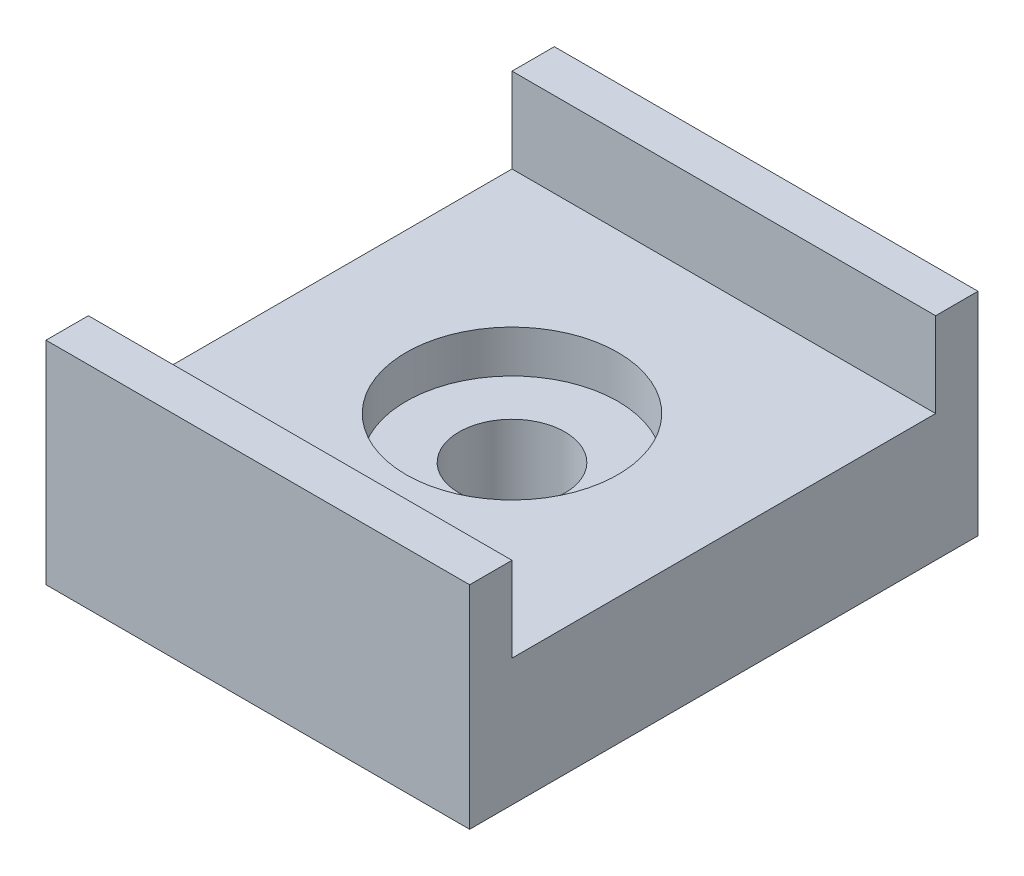
ISO-10303-21;
HEADER;
FILE_DESCRIPTION(('STEP AP214'),'2;1');
FILE_NAME('part.step','',(''),(''),'','','');
FILE_SCHEMA(('AUTOMOTIVE_DESIGN { 1 0 10303 214 1 1 1 1 }'));
ENDSEC;
DATA;
#1=APPLICATION_CONTEXT('core data for automotive mechanical design processes');
#2=APPLICATION_PROTOCOL_DEFINITION('international standard','automotive_design',2000,#1);
#3=PRODUCT_CONTEXT('',#1,'mechanical');
#4=PRODUCT('Part','Part','',(#3));
#5=PRODUCT_RELATED_PRODUCT_CATEGORY('part','',(#4));
#6=PRODUCT_DEFINITION_FORMATION('','',#4);
#7=PRODUCT_DEFINITION_CONTEXT('part definition',#1,'design');
#8=PRODUCT_DEFINITION('design','',#6,#7);
#9=PRODUCT_DEFINITION_SHAPE('','',#8);
#10=(LENGTH_UNIT() NAMED_UNIT(*) SI_UNIT(.MILLI.,.METRE.));
#11=(NAMED_UNIT(*) PLANE_ANGLE_UNIT() SI_UNIT($,.RADIAN.));
#12=(NAMED_UNIT(*) SI_UNIT($,.STERADIAN.) SOLID_ANGLE_UNIT());
#13=UNCERTAINTY_MEASURE_WITH_UNIT(LENGTH_MEASURE(1.E-05),#10,'distance_accuracy_value','');
#14=(GEOMETRIC_REPRESENTATION_CONTEXT(3) GLOBAL_UNCERTAINTY_ASSIGNED_CONTEXT((#13)) GLOBAL_UNIT_ASSIGNED_CONTEXT((#10,
#11,#12)) REPRESENTATION_CONTEXT('',''));
#15=CARTESIAN_POINT('',(0.,0.,0.));
#16=DIRECTION('',(0.,0.,1.));
#17=DIRECTION('',(1.,0.,0.));
#18=AXIS2_PLACEMENT_3D('',#15,#16,#17);
#19=CARTESIAN_POINT('',(12.7,0.,-15.24));
#20=DIRECTION('',(0.,1.,0.));
#21=DIRECTION('',(0.,0.,1.));
#22=AXIS2_PLACEMENT_3D('',#19,#20,#21);
#23=CYLINDRICAL_SURFACE('',#22,3.175);
#24=CARTESIAN_POINT('',(12.7,0.,-15.24));
#25=DIRECTION('',(0.,1.,0.));
#26=DIRECTION('',(0.,0.,1.));
#27=AXIS2_PLACEMENT_3D('',#24,#25,#26);
#28=CIRCLE('',#27,3.175);
#29=CARTESIAN_POINT('',(12.7,0.,-12.065));
#30=VERTEX_POINT('',#29);
#31=EDGE_CURVE('E141',#30,#30,#28,.T.);
#32=CARTESIAN_POINT('',(12.7,5.08,-15.24));
#33=DIRECTION('',(0.,1.,0.));
#34=DIRECTION('',(0.,0.,1.));
#35=AXIS2_PLACEMENT_3D('',#32,#33,#34);
#36=CIRCLE('',#35,3.175);
#37=CARTESIAN_POINT('',(12.7,5.08,-12.065));
#38=VERTEX_POINT('',#37);
#39=EDGE_CURVE('E43',#38,#38,#36,.F.);
#40=CARTESIAN_POINT('',(12.7,0.,-12.065));
#41=CARTESIAN_POINT('',(12.7,0.0529166666666667,-12.065));
#42=CARTESIAN_POINT('',(12.7,0.105833333333333,-12.065));
#43=CARTESIAN_POINT('',(12.7,0.211666666666667,-12.065));
#44=CARTESIAN_POINT('',(12.7,0.264583333333333,-12.065));
#45=CARTESIAN_POINT('',(12.7,0.370416666666667,-12.065));
#46=CARTESIAN_POINT('',(12.7,0.423333333333333,-12.065));
#47=CARTESIAN_POINT('',(12.7,0.529166666666666,-12.065));
#48=CARTESIAN_POINT('',(12.7,0.582083333333333,-12.065));
#49=CARTESIAN_POINT('',(12.7,0.687916666666667,-12.065));
#50=CARTESIAN_POINT('',(12.7,0.740833333333333,-12.065));
#51=CARTESIAN_POINT('',(12.7,0.846666666666666,-12.065));
#52=CARTESIAN_POINT('',(12.7,0.899583333333333,-12.065));
#53=CARTESIAN_POINT('',(12.7,1.00541666666667,-12.065));
#54=CARTESIAN_POINT('',(12.7,1.05833333333333,-12.065));
#55=CARTESIAN_POINT('',(12.7,1.16416666666667,-12.065));
#56=CARTESIAN_POINT('',(12.7,1.21708333333333,-12.065));
#57=CARTESIAN_POINT('',(12.7,1.32291666666667,-12.065));
#58=CARTESIAN_POINT('',(12.7,1.37583333333333,-12.065));
#59=CARTESIAN_POINT('',(12.7,1.48166666666667,-12.065));
#60=CARTESIAN_POINT('',(12.7,1.53458333333333,-12.065));
#61=CARTESIAN_POINT('',(12.7,1.64041666666667,-12.065));
#62=CARTESIAN_POINT('',(12.7,1.69333333333333,-12.065));
#63=CARTESIAN_POINT('',(12.7,1.79916666666667,-12.065));
#64=CARTESIAN_POINT('',(12.7,1.85208333333333,-12.065));
#65=CARTESIAN_POINT('',(12.7,1.95791666666667,-12.065));
#66=CARTESIAN_POINT('',(12.7,2.01083333333333,-12.065));
#67=CARTESIAN_POINT('',(12.7,2.11666666666667,-12.065));
#68=CARTESIAN_POINT('',(12.7,2.16958333333333,-12.065));
#69=CARTESIAN_POINT('',(12.7,2.27541666666667,-12.065));
#70=CARTESIAN_POINT('',(12.7,2.32833333333333,-12.065));
#71=CARTESIAN_POINT('',(12.7,2.43416666666667,-12.065));
#72=CARTESIAN_POINT('',(12.7,2.48708333333333,-12.065));
#73=CARTESIAN_POINT('',(12.7,2.59291666666667,-12.065));
#74=CARTESIAN_POINT('',(12.7,2.64583333333333,-12.065));
#75=CARTESIAN_POINT('',(12.7,2.75166666666667,-12.065));
#76=CARTESIAN_POINT('',(12.7,2.80458333333333,-12.065));
#77=CARTESIAN_POINT('',(12.7,2.91041666666667,-12.065));
#78=CARTESIAN_POINT('',(12.7,2.96333333333333,-12.065));
#79=CARTESIAN_POINT('',(12.7,3.06916666666667,-12.065));
#80=CARTESIAN_POINT('',(12.7,3.12208333333333,-12.065));
#81=CARTESIAN_POINT('',(12.7,3.22791666666667,-12.065));
#82=CARTESIAN_POINT('',(12.7,3.28083333333333,-12.065));
#83=CARTESIAN_POINT('',(12.7,3.38666666666667,-12.065));
#84=CARTESIAN_POINT('',(12.7,3.43958333333333,-12.065));
#85=CARTESIAN_POINT('',(12.7,3.54541666666667,-12.065));
#86=CARTESIAN_POINT('',(12.7,3.59833333333333,-12.065));
#87=CARTESIAN_POINT('',(12.7,3.70416666666667,-12.065));
#88=CARTESIAN_POINT('',(12.7,3.75708333333333,-12.065));
#89=CARTESIAN_POINT('',(12.7,3.86291666666667,-12.065));
#90=CARTESIAN_POINT('',(12.7,3.91583333333333,-12.065));
#91=CARTESIAN_POINT('',(12.7,4.02166666666666,-12.065));
#92=CARTESIAN_POINT('',(12.7,4.07458333333333,-12.065));
#93=CARTESIAN_POINT('',(12.7,4.18041666666667,-12.065));
#94=CARTESIAN_POINT('',(12.7,4.23333333333333,-12.065));
#95=CARTESIAN_POINT('',(12.7,4.33916666666666,-12.065));
#96=CARTESIAN_POINT('',(12.7,4.39208333333333,-12.065));
#97=CARTESIAN_POINT('',(12.7,4.49791666666667,-12.065));
#98=CARTESIAN_POINT('',(12.7,4.55083333333333,-12.065));
#99=CARTESIAN_POINT('',(12.7,4.65666666666666,-12.065));
#100=CARTESIAN_POINT('',(12.7,4.70958333333333,-12.065));
#101=CARTESIAN_POINT('',(12.7,4.81541666666666,-12.065));
#102=CARTESIAN_POINT('',(12.7,4.86833333333333,-12.065));
#103=CARTESIAN_POINT('',(12.7,4.97416666666667,-12.065));
#104=CARTESIAN_POINT('',(12.7,5.02708333333333,-12.065));
#105=CARTESIAN_POINT('',(12.7,5.08,-12.065));
#106=B_SPLINE_CURVE_WITH_KNOTS('',3,(#40,#41,#42,#43,#44,#45,#46,#47,#48,#49,#50,#51,#52,#53,
#54,#55,#56,#57,#58,#59,#60,#61,#62,#63,#64,#65,#66,#67,#68,#69,#70,#71,#72,#73,#74,#75,#76,#77,
#78,#79,#80,#81,#82,#83,#84,#85,#86,#87,#88,#89,#90,#91,#92,#93,#94,#95,#96,#97,#98,#99,#100,
#101,#102,#103,#104,#105),.UNSPECIFIED.,.F.,.F.,(4,2,2,2,2,2,2,2,2,2,2,2,2,2,2,2,2,2,2,2,2,2,2,
2,2,2,2,2,2,2,2,2,4),(0.,0.15875,0.3175,0.47625,0.635,0.79375,0.9525,1.11125,1.27,1.42875,
1.5875,1.74625,1.905,2.06375,2.2225,2.38125,2.54,2.69875,2.8575,3.01625,3.175,3.33375,3.4925,
3.65125,3.81,3.96875,4.1275,4.28625,4.445,4.60375,4.7625,4.92125,5.08),.UNSPECIFIED.);
#107=EDGE_CURVE('BSEAM39',#30,#38,#106,.T.);
#108=ORIENTED_EDGE('',*,*,#31,.F.);
#109=ORIENTED_EDGE('',*,*,#39,.F.);
#110=ORIENTED_EDGE('',*,*,#107,.T.);
#111=ORIENTED_EDGE('',*,*,#107,.F.);
#112=EDGE_LOOP('',(#108,#110,#109,#111));
#113=FACE_BOUND('',#112,.T.);
#114=ADVANCED_FACE('F39',(#113),#23,.F.);
#115=CARTESIAN_POINT('',(25.4,0.,0.));
#116=DIRECTION('',(0.,0.,-1.));
#117=DIRECTION('',(-1.,0.,0.));
#118=AXIS2_PLACEMENT_3D('',#115,#116,#117);
#119=PLANE('',#118);
#120=DIRECTION('',(0.,-1.,0.));
#121=VECTOR('',#120,1.);
#122=CARTESIAN_POINT('',(0.,0.,0.));
#123=LINE('',#122,#121);
#124=CARTESIAN_POINT('',(0.,12.7,0.));
#125=VERTEX_POINT('',#124);
#126=CARTESIAN_POINT('',(0.,0.,0.));
#127=VERTEX_POINT('',#126);
#128=EDGE_CURVE('E137',#125,#127,#123,.T.);
#129=ORIENTED_EDGE('',*,*,#128,.T.);
#130=DIRECTION('',(-1.,0.,0.));
#131=VECTOR('',#130,1.);
#132=CARTESIAN_POINT('',(25.4,0.,0.));
#133=LINE('',#132,#131);
#134=CARTESIAN_POINT('',(25.4,0.,0.));
#135=VERTEX_POINT('',#134);
#136=EDGE_CURVE('E11',#135,#127,#133,.T.);
#137=ORIENTED_EDGE('',*,*,#136,.F.);
#138=DIRECTION('',(0.,-1.,0.));
#139=VECTOR('',#138,1.);
#140=CARTESIAN_POINT('',(25.4,0.,0.));
#141=LINE('',#140,#139);
#142=CARTESIAN_POINT('',(25.4,12.7,0.));
#143=VERTEX_POINT('',#142);
#144=EDGE_CURVE('E152',#143,#135,#141,.T.);
#145=ORIENTED_EDGE('',*,*,#144,.F.);
#146=DIRECTION('',(-1.,0.,0.));
#147=VECTOR('',#146,1.);
#148=CARTESIAN_POINT('',(25.4,12.7,0.));
#149=LINE('',#148,#147);
#150=EDGE_CURVE('E133',#143,#125,#149,.T.);
#151=ORIENTED_EDGE('',*,*,#150,.T.);
#152=EDGE_LOOP('',(#129,#137,#145,#151));
#153=FACE_BOUND('',#152,.T.);
#154=ADVANCED_FACE('F41',(#153),#119,.F.);
#155=CARTESIAN_POINT('',(25.4,0.,0.));
#156=DIRECTION('',(0.,1.,0.));
#157=DIRECTION('',(0.,0.,1.));
#158=AXIS2_PLACEMENT_3D('',#155,#156,#157);
#159=PLANE('',#158);
#160=ORIENTED_EDGE('',*,*,#31,.T.);
#161=EDGE_LOOP('',(#160));
#162=FACE_BOUND('',#161,.T.);
#163=DIRECTION('',(0.,0.,-1.));
#164=VECTOR('',#163,1.);
#165=CARTESIAN_POINT('',(0.,0.,0.));
#166=LINE('',#165,#164);
#167=CARTESIAN_POINT('',(0.,0.,-30.48));
#168=VERTEX_POINT('',#167);
#169=EDGE_CURVE('E140',#127,#168,#166,.T.);
#170=ORIENTED_EDGE('',*,*,#169,.T.);
#171=DIRECTION('',(-1.,0.,0.));
#172=VECTOR('',#171,1.);
#173=CARTESIAN_POINT('',(25.4,0.,-30.48));
#174=LINE('',#173,#172);
#175=CARTESIAN_POINT('',(25.4,0.,-30.48));
#176=VERTEX_POINT('',#175);
#177=EDGE_CURVE('E49',#176,#168,#174,.T.);
#178=ORIENTED_EDGE('',*,*,#177,.F.);
#179=DIRECTION('',(0.,0.,-1.));
#180=VECTOR('',#179,1.);
#181=CARTESIAN_POINT('',(25.4,0.,0.));
#182=LINE('',#181,#180);
#183=EDGE_CURVE('E100',#135,#176,#182,.T.);
#184=ORIENTED_EDGE('',*,*,#183,.F.);
#185=ORIENTED_EDGE('',*,*,#136,.T.);
#186=EDGE_LOOP('',(#170,#178,#184,#185));
#187=FACE_BOUND('',#186,.T.);
#188=ADVANCED_FACE('F208',(#162,#187),#159,.F.);
#189=CARTESIAN_POINT('',(25.4,0.,-30.48));
#190=DIRECTION('',(0.,0.,1.));
#191=DIRECTION('',(1.,0.,0.));
#192=AXIS2_PLACEMENT_3D('',#189,#190,#191);
#193=PLANE('',#192);
#194=DIRECTION('',(0.,1.,0.));
#195=VECTOR('',#194,1.);
#196=CARTESIAN_POINT('',(0.,0.,-30.48));
#197=LINE('',#196,#195);
#198=CARTESIAN_POINT('',(0.,12.7,-30.48));
#199=VERTEX_POINT('',#198);
#200=EDGE_CURVE('E143',#168,#199,#197,.T.);
#201=ORIENTED_EDGE('',*,*,#200,.T.);
#202=DIRECTION('',(-1.,0.,0.));
#203=VECTOR('',#202,1.);
#204=CARTESIAN_POINT('',(25.4,12.7,-30.48));
#205=LINE('',#204,#203);
#206=CARTESIAN_POINT('',(25.4,12.7,-30.48));
#207=VERTEX_POINT('',#206);
#208=EDGE_CURVE('E159',#207,#199,#205,.T.);
#209=ORIENTED_EDGE('',*,*,#208,.F.);
#210=DIRECTION('',(0.,1.,0.));
#211=VECTOR('',#210,1.);
#212=CARTESIAN_POINT('',(25.4,0.,-30.48));
#213=LINE('',#212,#211);
#214=EDGE_CURVE('E168',#176,#207,#213,.T.);
#215=ORIENTED_EDGE('',*,*,#214,.F.);
#216=ORIENTED_EDGE('',*,*,#177,.T.);
#217=EDGE_LOOP('',(#201,#209,#215,#216));
#218=FACE_BOUND('',#217,.T.);
#219=ADVANCED_FACE('F166',(#218),#193,.F.);
#220=CARTESIAN_POINT('',(25.4,12.7,-27.94));
#221=DIRECTION('',(0.,-1.,0.));
#222=DIRECTION('',(0.,0.,-1.));
#223=AXIS2_PLACEMENT_3D('',#220,#221,#222);
#224=PLANE('',#223);
#225=DIRECTION('',(0.,0.,1.));
#226=VECTOR('',#225,1.);
#227=CARTESIAN_POINT('',(0.,12.7,-27.94));
#228=LINE('',#227,#226);
#229=CARTESIAN_POINT('',(0.,12.7,-27.94));
#230=VERTEX_POINT('',#229);
#231=EDGE_CURVE('E145',#199,#230,#228,.T.);
#232=ORIENTED_EDGE('',*,*,#231,.T.);
#233=DIRECTION('',(-1.,0.,0.));
#234=VECTOR('',#233,1.);
#235=CARTESIAN_POINT('',(25.4,12.7,-27.94));
#236=LINE('',#235,#234);
#237=CARTESIAN_POINT('',(25.4,12.7,-27.94));
#238=VERTEX_POINT('',#237);
#239=EDGE_CURVE('E156',#238,#230,#236,.T.);
#240=ORIENTED_EDGE('',*,*,#239,.F.);
#241=DIRECTION('',(0.,0.,1.));
#242=VECTOR('',#241,1.);
#243=CARTESIAN_POINT('',(25.4,12.7,-27.94));
#244=LINE('',#243,#242);
#245=EDGE_CURVE('E180',#207,#238,#244,.T.);
#246=ORIENTED_EDGE('',*,*,#245,.F.);
#247=ORIENTED_EDGE('',*,*,#208,.T.);
#248=EDGE_LOOP('',(#232,#240,#246,#247));
#249=FACE_BOUND('',#248,.T.);
#250=ADVANCED_FACE('F176',(#249),#224,.F.);
#251=CARTESIAN_POINT('',(25.4,12.7,-27.94));
#252=DIRECTION('',(0.,0.,-1.));
#253=DIRECTION('',(-1.,0.,0.));
#254=AXIS2_PLACEMENT_3D('',#251,#252,#253);
#255=PLANE('',#254);
#256=DIRECTION('',(0.,-1.,0.));
#257=VECTOR('',#256,1.);
#258=CARTESIAN_POINT('',(0.,12.7,-27.94));
#259=LINE('',#258,#257);
#260=CARTESIAN_POINT('',(0.,7.62,-27.94));
#261=VERTEX_POINT('',#260);
#262=EDGE_CURVE('E147',#230,#261,#259,.T.);
#263=ORIENTED_EDGE('',*,*,#262,.T.);
#264=DIRECTION('',(-1.,0.,0.));
#265=VECTOR('',#264,1.);
#266=CARTESIAN_POINT('',(25.4,7.62,-27.94));
#267=LINE('',#266,#265);
#268=CARTESIAN_POINT('',(25.4,7.62,-27.94));
#269=VERTEX_POINT('',#268);
#270=EDGE_CURVE('E128',#269,#261,#267,.T.);
#271=ORIENTED_EDGE('',*,*,#270,.F.);
#272=DIRECTION('',(0.,-1.,0.));
#273=VECTOR('',#272,1.);
#274=CARTESIAN_POINT('',(25.4,12.7,-27.94));
#275=LINE('',#274,#273);
#276=EDGE_CURVE('E119',#238,#269,#275,.T.);
#277=ORIENTED_EDGE('',*,*,#276,.F.);
#278=ORIENTED_EDGE('',*,*,#239,.T.);
#279=EDGE_LOOP('',(#263,#271,#277,#278));
#280=FACE_BOUND('',#279,.T.);
#281=ADVANCED_FACE('F179',(#280),#255,.F.);
#282=CARTESIAN_POINT('',(25.4,7.62,-2.53999999999999));
#283=DIRECTION('',(0.,-1.,0.));
#284=DIRECTION('',(0.,0.,-1.));
#285=AXIS2_PLACEMENT_3D('',#282,#283,#284);
#286=PLANE('',#285);
#287=CARTESIAN_POINT('',(12.7,7.62,-15.24));
#288=DIRECTION('',(0.,1.,0.));
#289=DIRECTION('',(0.,0.,1.));
#290=AXIS2_PLACEMENT_3D('',#287,#288,#289);
#291=CIRCLE('',#290,6.35);
#292=CARTESIAN_POINT('',(12.7,7.62,-8.89));
#293=VERTEX_POINT('',#292);
#294=EDGE_CURVE('E188',#293,#293,#291,.T.);
#295=ORIENTED_EDGE('',*,*,#294,.F.);
#296=EDGE_LOOP('',(#295));
#297=FACE_BOUND('',#296,.T.);
#298=DIRECTION('',(0.,0.,1.));
#299=VECTOR('',#298,1.);
#300=CARTESIAN_POINT('',(0.,7.62,-2.53999999999999));
#301=LINE('',#300,#299);
#302=CARTESIAN_POINT('',(0.,7.62,-2.53999999999999));
#303=VERTEX_POINT('',#302);
#304=EDGE_CURVE('E127',#261,#303,#301,.T.);
#305=ORIENTED_EDGE('',*,*,#304,.T.);
#306=DIRECTION('',(-1.,0.,0.));
#307=VECTOR('',#306,1.);
#308=CARTESIAN_POINT('',(25.4,7.62,-2.53999999999999));
#309=LINE('',#308,#307);
#310=CARTESIAN_POINT('',(25.4,7.62,-2.53999999999999));
#311=VERTEX_POINT('',#310);
#312=EDGE_CURVE('E124',#311,#303,#309,.T.);
#313=ORIENTED_EDGE('',*,*,#312,.F.);
#314=DIRECTION('',(0.,0.,1.));
#315=VECTOR('',#314,1.);
#316=CARTESIAN_POINT('',(25.4,7.62,-2.53999999999999));
#317=LINE('',#316,#315);
#318=EDGE_CURVE('E113',#269,#311,#317,.T.);
#319=ORIENTED_EDGE('',*,*,#318,.F.);
#320=ORIENTED_EDGE('',*,*,#270,.T.);
#321=EDGE_LOOP('',(#305,#313,#319,#320));
#322=FACE_BOUND('',#321,.T.);
#323=ADVANCED_FACE('F125',(#297,#322),#286,.F.);
#324=CARTESIAN_POINT('',(25.4,12.7,-2.54));
#325=DIRECTION('',(0.,0.,1.));
#326=DIRECTION('',(0.,-1.,0.));
#327=AXIS2_PLACEMENT_3D('',#324,#325,#326);
#328=PLANE('',#327);
#329=DIRECTION('',(0.,1.,0.));
#330=VECTOR('',#329,1.);
#331=CARTESIAN_POINT('',(0.,12.7,-2.54));
#332=LINE('',#331,#330);
#333=CARTESIAN_POINT('',(0.,12.7,-2.54));
#334=VERTEX_POINT('',#333);
#335=EDGE_CURVE('E86',#303,#334,#332,.T.);
#336=ORIENTED_EDGE('',*,*,#335,.T.);
#337=DIRECTION('',(-1.,0.,0.));
#338=VECTOR('',#337,1.);
#339=CARTESIAN_POINT('',(25.4,12.7,-2.54));
#340=LINE('',#339,#338);
#341=CARTESIAN_POINT('',(25.4,12.7,-2.54));
#342=VERTEX_POINT('',#341);
#343=EDGE_CURVE('E129',#342,#334,#340,.T.);
#344=ORIENTED_EDGE('',*,*,#343,.F.);
#345=DIRECTION('',(0.,1.,0.));
#346=VECTOR('',#345,1.);
#347=CARTESIAN_POINT('',(25.4,12.7,-2.54));
#348=LINE('',#347,#346);
#349=EDGE_CURVE('E117',#311,#342,#348,.T.);
#350=ORIENTED_EDGE('',*,*,#349,.F.);
#351=ORIENTED_EDGE('',*,*,#312,.T.);
#352=EDGE_LOOP('',(#336,#344,#350,#351));
#353=FACE_BOUND('',#352,.T.);
#354=ADVANCED_FACE('F131',(#353),#328,.F.);
#355=CARTESIAN_POINT('',(25.4,12.7,0.));
#356=DIRECTION('',(0.,-1.,0.));
#357=DIRECTION('',(0.,0.,-1.));
#358=AXIS2_PLACEMENT_3D('',#355,#356,#357);
#359=PLANE('',#358);
#360=DIRECTION('',(0.,0.,1.));
#361=VECTOR('',#360,1.);
#362=CARTESIAN_POINT('',(0.,12.7,0.));
#363=LINE('',#362,#361);
#364=EDGE_CURVE('E92',#334,#125,#363,.T.);
#365=ORIENTED_EDGE('',*,*,#364,.T.);
#366=ORIENTED_EDGE('',*,*,#150,.F.);
#367=DIRECTION('',(0.,0.,1.));
#368=VECTOR('',#367,1.);
#369=CARTESIAN_POINT('',(25.4,12.7,0.));
#370=LINE('',#369,#368);
#371=EDGE_CURVE('E57',#342,#143,#370,.T.);
#372=ORIENTED_EDGE('',*,*,#371,.F.);
#373=ORIENTED_EDGE('',*,*,#343,.T.);
#374=EDGE_LOOP('',(#365,#366,#372,#373));
#375=FACE_BOUND('',#374,.T.);
#376=ADVANCED_FACE('F217',(#375),#359,.F.);
#377=CARTESIAN_POINT('',(25.4,0.,0.));
#378=DIRECTION('',(-1.,0.,0.));
#379=DIRECTION('',(0.,0.,1.));
#380=AXIS2_PLACEMENT_3D('',#377,#378,#379);
#381=PLANE('',#380);
#382=ORIENTED_EDGE('',*,*,#144,.T.);
#383=ORIENTED_EDGE('',*,*,#183,.T.);
#384=ORIENTED_EDGE('',*,*,#214,.T.);
#385=ORIENTED_EDGE('',*,*,#245,.T.);
#386=ORIENTED_EDGE('',*,*,#276,.T.);
#387=ORIENTED_EDGE('',*,*,#318,.T.);
#388=ORIENTED_EDGE('',*,*,#349,.T.);
#389=ORIENTED_EDGE('',*,*,#371,.T.);
#390=EDGE_LOOP('',(#382,#383,#384,#385,#386,#387,#388,#389));
#391=FACE_BOUND('',#390,.T.);
#392=ADVANCED_FACE('F115',(#391),#381,.F.);
#393=CARTESIAN_POINT('',(0.,0.,0.));
#394=DIRECTION('',(-1.,0.,0.));
#395=DIRECTION('',(0.,0.,1.));
#396=AXIS2_PLACEMENT_3D('',#393,#394,#395);
#397=PLANE('',#396);
#398=ORIENTED_EDGE('',*,*,#128,.F.);
#399=ORIENTED_EDGE('',*,*,#364,.F.);
#400=ORIENTED_EDGE('',*,*,#335,.F.);
#401=ORIENTED_EDGE('',*,*,#304,.F.);
#402=ORIENTED_EDGE('',*,*,#262,.F.);
#403=ORIENTED_EDGE('',*,*,#231,.F.);
#404=ORIENTED_EDGE('',*,*,#200,.F.);
#405=ORIENTED_EDGE('',*,*,#169,.F.);
#406=EDGE_LOOP('',(#398,#399,#400,#401,#402,#403,#404,#405));
#407=FACE_BOUND('',#406,.T.);
#408=ADVANCED_FACE('F172',(#407),#397,.T.);
#409=CARTESIAN_POINT('',(12.7,5.08,-15.24));
#410=DIRECTION('',(0.,1.,0.));
#411=DIRECTION('',(0.,0.,1.));
#412=AXIS2_PLACEMENT_3D('',#409,#410,#411);
#413=PLANE('',#412);
#414=CARTESIAN_POINT('',(12.7,5.08,-15.24));
#415=DIRECTION('',(0.,1.,0.));
#416=DIRECTION('',(0.,0.,1.));
#417=AXIS2_PLACEMENT_3D('',#414,#415,#416);
#418=CIRCLE('',#417,6.35);
#419=CARTESIAN_POINT('',(12.7,5.08,-8.89));
#420=VERTEX_POINT('',#419);
#421=EDGE_CURVE('E191',#420,#420,#418,.T.);
#422=ORIENTED_EDGE('',*,*,#421,.T.);
#423=EDGE_LOOP('',(#422));
#424=FACE_BOUND('',#423,.T.);
#425=ORIENTED_EDGE('',*,*,#39,.T.);
#426=EDGE_LOOP('',(#425));
#427=FACE_BOUND('',#426,.T.);
#428=ADVANCED_FACE('F198',(#424,#427),#413,.T.);
#429=CARTESIAN_POINT('',(12.7,5.08,-15.24));
#430=DIRECTION('',(0.,1.,0.));
#431=DIRECTION('',(0.,0.,1.));
#432=AXIS2_PLACEMENT_3D('',#429,#430,#431);
#433=CYLINDRICAL_SURFACE('',#432,6.35);
#434=ORIENTED_EDGE('',*,*,#421,.F.);
#435=EDGE_LOOP('',(#434));
#436=FACE_BOUND('',#435,.T.);
#437=ORIENTED_EDGE('',*,*,#294,.T.);
#438=EDGE_LOOP('',(#437));
#439=FACE_BOUND('',#438,.T.);
#440=ADVANCED_FACE('F213',(#436,#439),#433,.F.);
#441=CLOSED_SHELL('',(#114,#154,#188,#219,#250,#281,#323,#354,#376,#392,#408,#428,#440));
#442=MANIFOLD_SOLID_BREP('B2',#441);
#443=ADVANCED_BREP_SHAPE_REPRESENTATION('',(#18,#442),#14);
#444=SHAPE_DEFINITION_REPRESENTATION(#9,#443);
ENDSEC;
END-ISO-10303-21;
